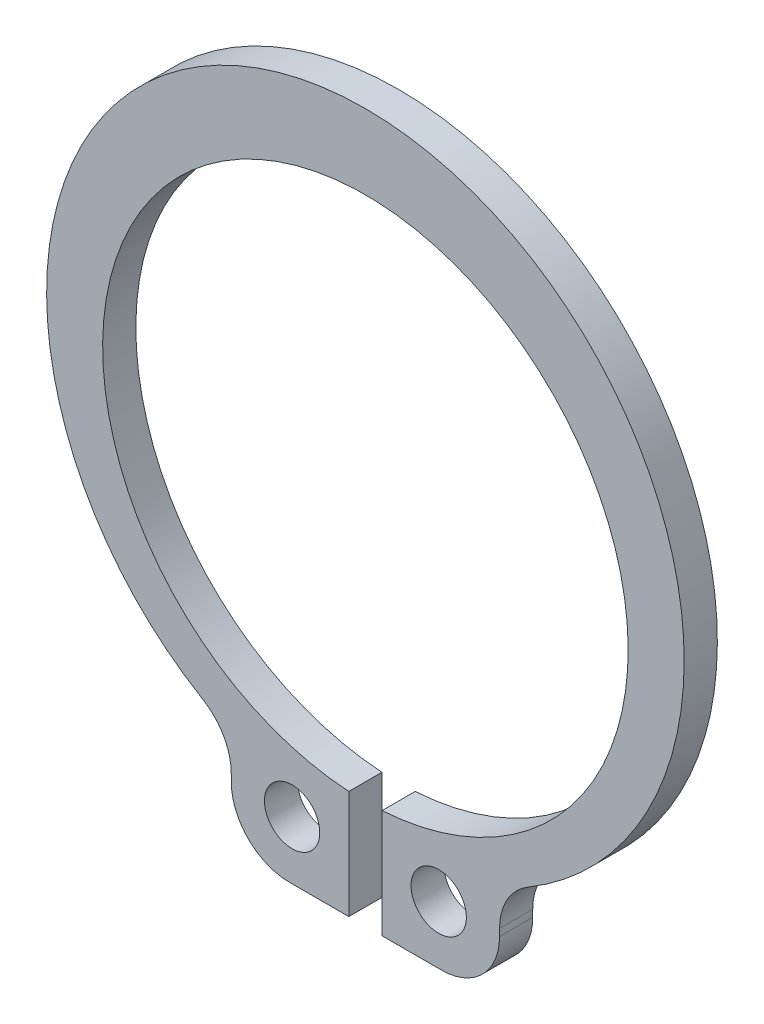
ISO-10303-21;
HEADER;
FILE_DESCRIPTION(('STEP AP214'),'2;1');
FILE_NAME('part.step','',(''),(''),'','','');
FILE_SCHEMA(('AUTOMOTIVE_DESIGN { 1 0 10303 214 1 1 1 1 }'));
ENDSEC;
DATA;
#1=APPLICATION_CONTEXT('core data for automotive mechanical design processes');
#2=APPLICATION_PROTOCOL_DEFINITION('international standard','automotive_design',2000,#1);
#3=PRODUCT_CONTEXT('',#1,'mechanical');
#4=PRODUCT('Part','Part','',(#3));
#5=PRODUCT_RELATED_PRODUCT_CATEGORY('part','',(#4));
#6=PRODUCT_DEFINITION_FORMATION('','',#4);
#7=PRODUCT_DEFINITION_CONTEXT('part definition',#1,'design');
#8=PRODUCT_DEFINITION('design','',#6,#7);
#9=PRODUCT_DEFINITION_SHAPE('','',#8);
#10=(LENGTH_UNIT() NAMED_UNIT(*) SI_UNIT(.MILLI.,.METRE.));
#11=(NAMED_UNIT(*) PLANE_ANGLE_UNIT() SI_UNIT($,.RADIAN.));
#12=(NAMED_UNIT(*) SI_UNIT($,.STERADIAN.) SOLID_ANGLE_UNIT());
#13=UNCERTAINTY_MEASURE_WITH_UNIT(LENGTH_MEASURE(1.E-05),#10,'distance_accuracy_value','');
#14=(GEOMETRIC_REPRESENTATION_CONTEXT(3) GLOBAL_UNCERTAINTY_ASSIGNED_CONTEXT((#13)) GLOBAL_UNIT_ASSIGNED_CONTEXT((#10,
#11,#12)) REPRESENTATION_CONTEXT('',''));
#15=CARTESIAN_POINT('',(0.,0.,0.));
#16=DIRECTION('',(0.,0.,1.));
#17=DIRECTION('',(1.,0.,0.));
#18=AXIS2_PLACEMENT_3D('',#15,#16,#17);
#19=CARTESIAN_POINT('',(0.,0.674999999999998,1.2));
#20=DIRECTION('',(0.,0.,-1.));
#21=DIRECTION('',(-1.,0.,0.));
#22=AXIS2_PLACEMENT_3D('',#19,#20,#21);
#23=CYLINDRICAL_SURFACE('',#22,11.525);
#24=CARTESIAN_POINT('',(0.,0.674999999999998,1.2));
#25=DIRECTION('',(0.,0.,1.));
#26=DIRECTION('',(1.,0.,0.));
#27=AXIS2_PLACEMENT_3D('',#24,#25,#26);
#28=CIRCLE('',#27,11.525);
#29=CARTESIAN_POINT('',(5.87880733944954,-9.23788299465066,1.2));
#30=VERTEX_POINT('',#29);
#31=CARTESIAN_POINT('',(-5.87880733944954,-9.23788299465066,1.2));
#32=VERTEX_POINT('',#31);
#33=EDGE_CURVE('E184',#30,#32,#28,.T.);
#34=ORIENTED_EDGE('',*,*,#33,.F.);
#35=DIRECTION('',(0.,0.,-1.));
#36=VECTOR('',#35,1.);
#37=CARTESIAN_POINT('',(5.87880733944954,-9.23788299465066,1.2));
#38=LINE('',#37,#36);
#39=CARTESIAN_POINT('',(5.87880733944954,-9.23788299465066,0.));
#40=VERTEX_POINT('',#39);
#41=EDGE_CURVE('E192',#30,#40,#38,.T.);
#42=ORIENTED_EDGE('',*,*,#41,.T.);
#43=CARTESIAN_POINT('',(0.,0.674999999999998,0.));
#44=DIRECTION('',(0.,0.,1.));
#45=DIRECTION('',(1.,0.,0.));
#46=AXIS2_PLACEMENT_3D('',#43,#44,#45);
#47=CIRCLE('',#46,11.525);
#48=CARTESIAN_POINT('',(-5.87880733944954,-9.23788299465066,0.));
#49=VERTEX_POINT('',#48);
#50=EDGE_CURVE('E166',#40,#49,#47,.T.);
#51=ORIENTED_EDGE('',*,*,#50,.T.);
#52=DIRECTION('',(0.,0.,-1.));
#53=VECTOR('',#52,1.);
#54=CARTESIAN_POINT('',(-5.87880733944954,-9.23788299465066,1.2));
#55=LINE('',#54,#53);
#56=EDGE_CURVE('E148',#49,#32,#55,.F.);
#57=ORIENTED_EDGE('',*,*,#56,.T.);
#58=EDGE_LOOP('',(#34,#42,#51,#57));
#59=FACE_BOUND('',#58,.T.);
#60=ADVANCED_FACE('F43',(#59),#23,.T.);
#61=CARTESIAN_POINT('',(-4.85,-9.77981348470646,1.2));
#62=DIRECTION('',(1.,0.,0.));
#63=DIRECTION('',(0.,0.,-1.));
#64=AXIS2_PLACEMENT_3D('',#61,#62,#63);
#65=PLANE('',#64);
#66=DIRECTION('',(0.,-1.,0.));
#67=VECTOR('',#66,1.);
#68=CARTESIAN_POINT('',(-4.85,-9.77981348470646,0.));
#69=LINE('',#68,#67);
#70=CARTESIAN_POINT('',(-4.85,-11.0441349936759,0.));
#71=VERTEX_POINT('',#70);
#72=CARTESIAN_POINT('',(-4.85,-11.3,0.));
#73=VERTEX_POINT('',#72);
#74=EDGE_CURVE('E169',#71,#73,#69,.T.);
#75=ORIENTED_EDGE('',*,*,#74,.T.);
#76=DIRECTION('',(0.,0.,-1.));
#77=VECTOR('',#76,1.);
#78=CARTESIAN_POINT('',(-4.85,-11.3,1.2));
#79=LINE('',#78,#77);
#80=CARTESIAN_POINT('',(-4.85,-11.3,1.2));
#81=VERTEX_POINT('',#80);
#82=EDGE_CURVE('E11',#73,#81,#79,.F.);
#83=ORIENTED_EDGE('',*,*,#82,.T.);
#84=DIRECTION('',(0.,-1.,0.));
#85=VECTOR('',#84,1.);
#86=CARTESIAN_POINT('',(-4.85,-9.77981348470646,1.2));
#87=LINE('',#86,#85);
#88=CARTESIAN_POINT('',(-4.85,-11.0441349936759,1.2));
#89=VERTEX_POINT('',#88);
#90=EDGE_CURVE('E139',#89,#81,#87,.T.);
#91=ORIENTED_EDGE('',*,*,#90,.F.);
#92=DIRECTION('',(0.,0.,1.));
#93=VECTOR('',#92,1.);
#94=CARTESIAN_POINT('',(-4.85,-11.0441349936759,0.));
#95=LINE('',#94,#93);
#96=EDGE_CURVE('E198',#89,#71,#95,.F.);
#97=ORIENTED_EDGE('',*,*,#96,.T.);
#98=EDGE_LOOP('',(#75,#83,#91,#97));
#99=FACE_BOUND('',#98,.T.);
#100=ADVANCED_FACE('F295',(#99),#65,.F.);
#101=CARTESIAN_POINT('',(-4.85,-13.4,1.2));
#102=DIRECTION('',(0.,1.,0.));
#103=DIRECTION('',(0.,0.,1.));
#104=AXIS2_PLACEMENT_3D('',#101,#102,#103);
#105=PLANE('',#104);
#106=DIRECTION('',(1.,0.,0.));
#107=VECTOR('',#106,1.);
#108=CARTESIAN_POINT('',(-4.85,-13.4,1.2));
#109=LINE('',#108,#107);
#110=CARTESIAN_POINT('',(-2.75,-13.4,1.2));
#111=VERTEX_POINT('',#110);
#112=CARTESIAN_POINT('',(-0.600000000000001,-13.4,1.2));
#113=VERTEX_POINT('',#112);
#114=EDGE_CURVE('E129',#111,#113,#109,.T.);
#115=ORIENTED_EDGE('',*,*,#114,.F.);
#116=DIRECTION('',(0.,0.,-1.));
#117=VECTOR('',#116,1.);
#118=CARTESIAN_POINT('',(-2.75,-13.4,1.2));
#119=LINE('',#118,#117);
#120=CARTESIAN_POINT('',(-2.75,-13.4,0.));
#121=VERTEX_POINT('',#120);
#122=EDGE_CURVE('E51',#111,#121,#119,.T.);
#123=ORIENTED_EDGE('',*,*,#122,.T.);
#124=DIRECTION('',(1.,0.,0.));
#125=VECTOR('',#124,1.);
#126=CARTESIAN_POINT('',(-4.85,-13.4,0.));
#127=LINE('',#126,#125);
#128=CARTESIAN_POINT('',(-0.600000000000001,-13.4,0.));
#129=VERTEX_POINT('',#128);
#130=EDGE_CURVE('E145',#121,#129,#127,.T.);
#131=ORIENTED_EDGE('',*,*,#130,.T.);
#132=DIRECTION('',(0.,0.,-1.));
#133=VECTOR('',#132,1.);
#134=CARTESIAN_POINT('',(-0.600000000000001,-13.4,1.2));
#135=LINE('',#134,#133);
#136=EDGE_CURVE('E142',#113,#129,#135,.T.);
#137=ORIENTED_EDGE('',*,*,#136,.F.);
#138=EDGE_LOOP('',(#115,#123,#131,#137));
#139=FACE_BOUND('',#138,.T.);
#140=ADVANCED_FACE('F143',(#139),#105,.F.);
#141=CARTESIAN_POINT('',(-0.600000000000001,-13.4,1.2));
#142=DIRECTION('',(-1.,0.,0.));
#143=DIRECTION('',(0.,-1.,0.));
#144=AXIS2_PLACEMENT_3D('',#141,#142,#143);
#145=PLANE('',#144);
#146=DIRECTION('',(0.,1.,0.));
#147=VECTOR('',#146,1.);
#148=CARTESIAN_POINT('',(-0.600000000000001,-13.4,0.));
#149=LINE('',#148,#147);
#150=CARTESIAN_POINT('',(-0.599999999999997,-9.48103369891701,0.));
#151=VERTEX_POINT('',#150);
#152=EDGE_CURVE('E173',#129,#151,#149,.T.);
#153=ORIENTED_EDGE('',*,*,#152,.T.);
#154=DIRECTION('',(0.,0.,-1.));
#155=VECTOR('',#154,1.);
#156=CARTESIAN_POINT('',(-0.599999999999997,-9.48103369891701,1.2));
#157=LINE('',#156,#155);
#158=CARTESIAN_POINT('',(-0.599999999999997,-9.48103369891701,1.2));
#159=VERTEX_POINT('',#158);
#160=EDGE_CURVE('E149',#159,#151,#157,.T.);
#161=ORIENTED_EDGE('',*,*,#160,.F.);
#162=DIRECTION('',(0.,1.,0.));
#163=VECTOR('',#162,1.);
#164=CARTESIAN_POINT('',(-0.600000000000001,-13.4,1.2));
#165=LINE('',#164,#163);
#166=EDGE_CURVE('E134',#113,#159,#165,.T.);
#167=ORIENTED_EDGE('',*,*,#166,.F.);
#168=ORIENTED_EDGE('',*,*,#136,.T.);
#169=EDGE_LOOP('',(#153,#161,#167,#168));
#170=FACE_BOUND('',#169,.T.);
#171=ADVANCED_FACE('F151',(#170),#145,.F.);
#172=CARTESIAN_POINT('',(0.,0.,1.2));
#173=DIRECTION('',(0.,0.,-1.));
#174=DIRECTION('',(-1.,0.,0.));
#175=AXIS2_PLACEMENT_3D('',#172,#173,#174);
#176=CYLINDRICAL_SURFACE('',#175,9.50000000000002);
#177=CARTESIAN_POINT('',(0.,0.,0.));
#178=DIRECTION('',(0.,0.,-1.));
#179=DIRECTION('',(-1.,0.,0.));
#180=AXIS2_PLACEMENT_3D('',#177,#178,#179);
#181=CIRCLE('',#180,9.50000000000002);
#182=CARTESIAN_POINT('',(0.600000000000001,-9.48103369891701,0.));
#183=VERTEX_POINT('',#182);
#184=EDGE_CURVE('E175',#151,#183,#181,.T.);
#185=ORIENTED_EDGE('',*,*,#184,.T.);
#186=DIRECTION('',(0.,0.,-1.));
#187=VECTOR('',#186,1.);
#188=CARTESIAN_POINT('',(0.600000000000001,-9.48103369891701,1.2));
#189=LINE('',#188,#187);
#190=CARTESIAN_POINT('',(0.600000000000001,-9.48103369891701,1.2));
#191=VERTEX_POINT('',#190);
#192=EDGE_CURVE('E187',#191,#183,#189,.T.);
#193=ORIENTED_EDGE('',*,*,#192,.F.);
#194=CARTESIAN_POINT('',(0.,0.,1.2));
#195=DIRECTION('',(0.,0.,-1.));
#196=DIRECTION('',(-1.,0.,0.));
#197=AXIS2_PLACEMENT_3D('',#194,#195,#196);
#198=CIRCLE('',#197,9.50000000000002);
#199=EDGE_CURVE('E154',#159,#191,#198,.T.);
#200=ORIENTED_EDGE('',*,*,#199,.F.);
#201=ORIENTED_EDGE('',*,*,#160,.T.);
#202=EDGE_LOOP('',(#185,#193,#200,#201));
#203=FACE_BOUND('',#202,.T.);
#204=ADVANCED_FACE('F229',(#203),#176,.F.);
#205=CARTESIAN_POINT('',(0.600000000000001,-9.48103369891701,1.2));
#206=DIRECTION('',(1.,0.,0.));
#207=DIRECTION('',(0.,1.,0.));
#208=AXIS2_PLACEMENT_3D('',#205,#206,#207);
#209=PLANE('',#208);
#210=DIRECTION('',(0.,-1.,0.));
#211=VECTOR('',#210,1.);
#212=CARTESIAN_POINT('',(0.600000000000001,-9.48103369891701,0.));
#213=LINE('',#212,#211);
#214=CARTESIAN_POINT('',(0.600000000000001,-13.4,0.));
#215=VERTEX_POINT('',#214);
#216=EDGE_CURVE('E177',#183,#215,#213,.T.);
#217=ORIENTED_EDGE('',*,*,#216,.T.);
#218=DIRECTION('',(0.,0.,-1.));
#219=VECTOR('',#218,1.);
#220=CARTESIAN_POINT('',(0.600000000000001,-13.4,1.2));
#221=LINE('',#220,#219);
#222=CARTESIAN_POINT('',(0.600000000000001,-13.4,1.2));
#223=VERTEX_POINT('',#222);
#224=EDGE_CURVE('E165',#223,#215,#221,.T.);
#225=ORIENTED_EDGE('',*,*,#224,.F.);
#226=DIRECTION('',(0.,-1.,0.));
#227=VECTOR('',#226,1.);
#228=CARTESIAN_POINT('',(0.600000000000001,-9.48103369891701,1.2));
#229=LINE('',#228,#227);
#230=EDGE_CURVE('E156',#191,#223,#229,.T.);
#231=ORIENTED_EDGE('',*,*,#230,.F.);
#232=ORIENTED_EDGE('',*,*,#192,.T.);
#233=EDGE_LOOP('',(#217,#225,#231,#232));
#234=FACE_BOUND('',#233,.T.);
#235=ADVANCED_FACE('F236',(#234),#209,.F.);
#236=CARTESIAN_POINT('',(0.600000000000001,-13.4,1.2));
#237=DIRECTION('',(0.,1.,0.));
#238=DIRECTION('',(-1.,0.,0.));
#239=AXIS2_PLACEMENT_3D('',#236,#237,#238);
#240=PLANE('',#239);
#241=DIRECTION('',(1.,0.,0.));
#242=VECTOR('',#241,1.);
#243=CARTESIAN_POINT('',(0.600000000000001,-13.4,0.));
#244=LINE('',#243,#242);
#245=CARTESIAN_POINT('',(2.75,-13.4,0.));
#246=VERTEX_POINT('',#245);
#247=EDGE_CURVE('E179',#215,#246,#244,.T.);
#248=ORIENTED_EDGE('',*,*,#247,.T.);
#249=DIRECTION('',(0.,0.,-1.));
#250=VECTOR('',#249,1.);
#251=CARTESIAN_POINT('',(2.75,-13.4,1.2));
#252=LINE('',#251,#250);
#253=CARTESIAN_POINT('',(2.75,-13.4,1.2));
#254=VERTEX_POINT('',#253);
#255=EDGE_CURVE('E217',#246,#254,#252,.F.);
#256=ORIENTED_EDGE('',*,*,#255,.T.);
#257=DIRECTION('',(1.,0.,0.));
#258=VECTOR('',#257,1.);
#259=CARTESIAN_POINT('',(0.600000000000001,-13.4,1.2));
#260=LINE('',#259,#258);
#261=EDGE_CURVE('E161',#223,#254,#260,.T.);
#262=ORIENTED_EDGE('',*,*,#261,.F.);
#263=ORIENTED_EDGE('',*,*,#224,.T.);
#264=EDGE_LOOP('',(#248,#256,#262,#263));
#265=FACE_BOUND('',#264,.T.);
#266=ADVANCED_FACE('F239',(#265),#240,.F.);
#267=CARTESIAN_POINT('',(4.85,-13.4,1.2));
#268=DIRECTION('',(-1.,0.,0.));
#269=DIRECTION('',(0.,-1.,0.));
#270=AXIS2_PLACEMENT_3D('',#267,#268,#269);
#271=PLANE('',#270);
#272=DIRECTION('',(0.,1.,0.));
#273=VECTOR('',#272,1.);
#274=CARTESIAN_POINT('',(4.85,-13.4,1.2));
#275=LINE('',#274,#273);
#276=CARTESIAN_POINT('',(4.85,-11.3,1.2));
#277=VERTEX_POINT('',#276);
#278=CARTESIAN_POINT('',(4.85,-11.0441349936759,1.2));
#279=VERTEX_POINT('',#278);
#280=EDGE_CURVE('E163',#277,#279,#275,.T.);
#281=ORIENTED_EDGE('',*,*,#280,.F.);
#282=DIRECTION('',(0.,0.,-1.));
#283=VECTOR('',#282,1.);
#284=CARTESIAN_POINT('',(4.85,-11.3,1.2));
#285=LINE('',#284,#283);
#286=CARTESIAN_POINT('',(4.85,-11.3,0.));
#287=VERTEX_POINT('',#286);
#288=EDGE_CURVE('E210',#277,#287,#285,.T.);
#289=ORIENTED_EDGE('',*,*,#288,.T.);
#290=DIRECTION('',(0.,1.,0.));
#291=VECTOR('',#290,1.);
#292=CARTESIAN_POINT('',(4.85,-13.4,0.));
#293=LINE('',#292,#291);
#294=CARTESIAN_POINT('',(4.85,-11.0441349936759,0.));
#295=VERTEX_POINT('',#294);
#296=EDGE_CURVE('E182',#287,#295,#293,.T.);
#297=ORIENTED_EDGE('',*,*,#296,.T.);
#298=DIRECTION('',(0.,0.,1.));
#299=VECTOR('',#298,1.);
#300=CARTESIAN_POINT('',(4.85,-11.0441349936759,1.2));
#301=LINE('',#300,#299);
#302=EDGE_CURVE('E195',#295,#279,#301,.T.);
#303=ORIENTED_EDGE('',*,*,#302,.T.);
#304=EDGE_LOOP('',(#281,#289,#297,#303));
#305=FACE_BOUND('',#304,.T.);
#306=ADVANCED_FACE('F246',(#305),#271,.F.);
#307=CARTESIAN_POINT('',(0.,0.674999999999998,1.2));
#308=DIRECTION('',(0.,0.,1.));
#309=DIRECTION('',(1.,0.,0.));
#310=AXIS2_PLACEMENT_3D('',#307,#308,#309);
#311=PLANE('',#310);
#312=CARTESIAN_POINT('',(-2.65,-11.3,1.2));
#313=DIRECTION('',(0.,0.,-1.));
#314=DIRECTION('',(-1.,0.,0.));
#315=AXIS2_PLACEMENT_3D('',#312,#313,#314);
#316=CIRCLE('',#315,1.);
#317=CARTESIAN_POINT('',(-3.65,-11.3,1.2));
#318=VERTEX_POINT('',#317);
#319=EDGE_CURVE('E263',#318,#318,#316,.T.);
#320=ORIENTED_EDGE('',*,*,#319,.T.);
#321=EDGE_LOOP('',(#320));
#322=FACE_BOUND('',#321,.T.);
#323=CARTESIAN_POINT('',(2.65,-11.3,1.2));
#324=DIRECTION('',(0.,0.,-1.));
#325=DIRECTION('',(-1.,0.,0.));
#326=AXIS2_PLACEMENT_3D('',#323,#324,#325);
#327=CIRCLE('',#326,1.);
#328=CARTESIAN_POINT('',(1.65,-11.3,1.2));
#329=VERTEX_POINT('',#328);
#330=EDGE_CURVE('E170',#329,#329,#327,.T.);
#331=ORIENTED_EDGE('',*,*,#330,.T.);
#332=EDGE_LOOP('',(#331));
#333=FACE_BOUND('',#332,.T.);
#334=ORIENTED_EDGE('',*,*,#261,.T.);
#335=CARTESIAN_POINT('',(2.75,-11.3,1.2));
#336=DIRECTION('',(0.,0.,1.));
#337=DIRECTION('',(1.,0.,0.));
#338=AXIS2_PLACEMENT_3D('',#335,#336,#337);
#339=CIRCLE('',#338,2.1);
#340=EDGE_CURVE('E220',#254,#277,#339,.T.);
#341=ORIENTED_EDGE('',*,*,#340,.T.);
#342=ORIENTED_EDGE('',*,*,#280,.T.);
#343=CARTESIAN_POINT('',(6.95,-11.0441349936759,1.2));
#344=DIRECTION('',(0.,0.,1.));
#345=DIRECTION('',(1.,0.,0.));
#346=AXIS2_PLACEMENT_3D('',#343,#344,#345);
#347=CIRCLE('',#346,2.1);
#348=EDGE_CURVE('E204',#279,#30,#347,.F.);
#349=ORIENTED_EDGE('',*,*,#348,.T.);
#350=ORIENTED_EDGE('',*,*,#33,.T.);
#351=CARTESIAN_POINT('',(-6.95,-11.0441349936759,1.2));
#352=DIRECTION('',(0.,0.,1.));
#353=DIRECTION('',(1.,0.,0.));
#354=AXIS2_PLACEMENT_3D('',#351,#352,#353);
#355=CIRCLE('',#354,2.1);
#356=EDGE_CURVE('E208',#32,#89,#355,.F.);
#357=ORIENTED_EDGE('',*,*,#356,.T.);
#358=ORIENTED_EDGE('',*,*,#90,.T.);
#359=CARTESIAN_POINT('',(-2.75,-11.3,1.2));
#360=DIRECTION('',(0.,0.,1.));
#361=DIRECTION('',(1.,0.,0.));
#362=AXIS2_PLACEMENT_3D('',#359,#360,#361);
#363=CIRCLE('',#362,2.1);
#364=EDGE_CURVE('E58',#81,#111,#363,.T.);
#365=ORIENTED_EDGE('',*,*,#364,.T.);
#366=ORIENTED_EDGE('',*,*,#114,.T.);
#367=ORIENTED_EDGE('',*,*,#166,.T.);
#368=ORIENTED_EDGE('',*,*,#199,.T.);
#369=ORIENTED_EDGE('',*,*,#230,.T.);
#370=EDGE_LOOP('',(#334,#341,#342,#349,#350,#357,#358,#365,#366,#367,#368,#369));
#371=FACE_BOUND('',#370,.T.);
#372=ADVANCED_FACE('F132',(#322,#333,#371),#311,.T.);
#373=CARTESIAN_POINT('',(0.,0.674999999999998,0.));
#374=DIRECTION('',(0.,0.,1.));
#375=DIRECTION('',(1.,0.,0.));
#376=AXIS2_PLACEMENT_3D('',#373,#374,#375);
#377=PLANE('',#376);
#378=CARTESIAN_POINT('',(-2.65,-11.3,0.));
#379=DIRECTION('',(0.,0.,-1.));
#380=DIRECTION('',(-1.,0.,0.));
#381=AXIS2_PLACEMENT_3D('',#378,#379,#380);
#382=CIRCLE('',#381,1.);
#383=CARTESIAN_POINT('',(-3.65,-11.3,0.));
#384=VERTEX_POINT('',#383);
#385=EDGE_CURVE('E266',#384,#384,#382,.T.);
#386=ORIENTED_EDGE('',*,*,#385,.F.);
#387=EDGE_LOOP('',(#386));
#388=FACE_BOUND('',#387,.T.);
#389=CARTESIAN_POINT('',(2.65,-11.3,0.));
#390=DIRECTION('',(0.,0.,-1.));
#391=DIRECTION('',(-1.,0.,0.));
#392=AXIS2_PLACEMENT_3D('',#389,#390,#391);
#393=CIRCLE('',#392,1.);
#394=CARTESIAN_POINT('',(1.65,-11.3,0.));
#395=VERTEX_POINT('',#394);
#396=EDGE_CURVE('E260',#395,#395,#393,.T.);
#397=ORIENTED_EDGE('',*,*,#396,.F.);
#398=EDGE_LOOP('',(#397));
#399=FACE_BOUND('',#398,.T.);
#400=ORIENTED_EDGE('',*,*,#296,.F.);
#401=CARTESIAN_POINT('',(2.75,-11.3,0.));
#402=DIRECTION('',(0.,0.,1.));
#403=DIRECTION('',(1.,0.,0.));
#404=AXIS2_PLACEMENT_3D('',#401,#402,#403);
#405=CIRCLE('',#404,2.1);
#406=EDGE_CURVE('E215',#287,#246,#405,.F.);
#407=ORIENTED_EDGE('',*,*,#406,.T.);
#408=ORIENTED_EDGE('',*,*,#247,.F.);
#409=ORIENTED_EDGE('',*,*,#216,.F.);
#410=ORIENTED_EDGE('',*,*,#184,.F.);
#411=ORIENTED_EDGE('',*,*,#152,.F.);
#412=ORIENTED_EDGE('',*,*,#130,.F.);
#413=CARTESIAN_POINT('',(-2.75,-11.3,0.));
#414=DIRECTION('',(0.,0.,1.));
#415=DIRECTION('',(1.,0.,0.));
#416=AXIS2_PLACEMENT_3D('',#413,#414,#415);
#417=CIRCLE('',#416,2.1);
#418=EDGE_CURVE('E213',#121,#73,#417,.F.);
#419=ORIENTED_EDGE('',*,*,#418,.T.);
#420=ORIENTED_EDGE('',*,*,#74,.F.);
#421=CARTESIAN_POINT('',(-6.95,-11.0441349936759,0.));
#422=DIRECTION('',(0.,0.,1.));
#423=DIRECTION('',(1.,0.,0.));
#424=AXIS2_PLACEMENT_3D('',#421,#422,#423);
#425=CIRCLE('',#424,2.1);
#426=EDGE_CURVE('E206',#71,#49,#425,.T.);
#427=ORIENTED_EDGE('',*,*,#426,.T.);
#428=ORIENTED_EDGE('',*,*,#50,.F.);
#429=CARTESIAN_POINT('',(6.95,-11.0441349936759,0.));
#430=DIRECTION('',(0.,0.,1.));
#431=DIRECTION('',(1.,0.,0.));
#432=AXIS2_PLACEMENT_3D('',#429,#430,#431);
#433=CIRCLE('',#432,2.1);
#434=EDGE_CURVE('E201',#40,#295,#433,.T.);
#435=ORIENTED_EDGE('',*,*,#434,.T.);
#436=EDGE_LOOP('',(#400,#407,#408,#409,#410,#411,#412,#419,#420,#427,#428,#435));
#437=FACE_BOUND('',#436,.T.);
#438=ADVANCED_FACE('F224',(#388,#399,#437),#377,.F.);
#439=CARTESIAN_POINT('',(2.65,-11.3,1.2));
#440=DIRECTION('',(0.,0.,-1.));
#441=DIRECTION('',(-1.,0.,0.));
#442=AXIS2_PLACEMENT_3D('',#439,#440,#441);
#443=CYLINDRICAL_SURFACE('',#442,1.);
#444=ORIENTED_EDGE('',*,*,#330,.F.);
#445=EDGE_LOOP('',(#444));
#446=FACE_BOUND('',#445,.T.);
#447=ORIENTED_EDGE('',*,*,#396,.T.);
#448=EDGE_LOOP('',(#447));
#449=FACE_BOUND('',#448,.T.);
#450=ADVANCED_FACE('F277',(#446,#449),#443,.F.);
#451=CARTESIAN_POINT('',(-2.65,-11.3,1.2));
#452=DIRECTION('',(0.,0.,-1.));
#453=DIRECTION('',(-1.,0.,0.));
#454=AXIS2_PLACEMENT_3D('',#451,#452,#453);
#455=CYLINDRICAL_SURFACE('',#454,1.);
#456=ORIENTED_EDGE('',*,*,#319,.F.);
#457=EDGE_LOOP('',(#456));
#458=FACE_BOUND('',#457,.T.);
#459=ORIENTED_EDGE('',*,*,#385,.T.);
#460=EDGE_LOOP('',(#459));
#461=FACE_BOUND('',#460,.T.);
#462=ADVANCED_FACE('F274',(#458,#461),#455,.F.);
#463=CARTESIAN_POINT('',(6.95,-11.0441349936759,1.2));
#464=DIRECTION('',(0.,0.,-1.));
#465=DIRECTION('',(-1.,0.,0.));
#466=AXIS2_PLACEMENT_3D('',#463,#464,#465);
#467=CYLINDRICAL_SURFACE('',#466,2.1);
#468=ORIENTED_EDGE('',*,*,#348,.F.);
#469=ORIENTED_EDGE('',*,*,#302,.F.);
#470=ORIENTED_EDGE('',*,*,#434,.F.);
#471=ORIENTED_EDGE('',*,*,#41,.F.);
#472=EDGE_LOOP('',(#468,#469,#470,#471));
#473=FACE_BOUND('',#472,.T.);
#474=ADVANCED_FACE('F251',(#473),#467,.F.);
#475=CARTESIAN_POINT('',(-6.95,-11.0441349936759,1.2));
#476=DIRECTION('',(0.,0.,-1.));
#477=DIRECTION('',(-1.,0.,0.));
#478=AXIS2_PLACEMENT_3D('',#475,#476,#477);
#479=CYLINDRICAL_SURFACE('',#478,2.1);
#480=ORIENTED_EDGE('',*,*,#356,.F.);
#481=ORIENTED_EDGE('',*,*,#56,.F.);
#482=ORIENTED_EDGE('',*,*,#426,.F.);
#483=ORIENTED_EDGE('',*,*,#96,.F.);
#484=EDGE_LOOP('',(#480,#481,#482,#483));
#485=FACE_BOUND('',#484,.T.);
#486=ADVANCED_FACE('F305',(#485),#479,.F.);
#487=CARTESIAN_POINT('',(2.75,-11.3,1.2));
#488=DIRECTION('',(0.,0.,-1.));
#489=DIRECTION('',(-1.,0.,0.));
#490=AXIS2_PLACEMENT_3D('',#487,#488,#489);
#491=CYLINDRICAL_SURFACE('',#490,2.1);
#492=ORIENTED_EDGE('',*,*,#340,.F.);
#493=ORIENTED_EDGE('',*,*,#255,.F.);
#494=ORIENTED_EDGE('',*,*,#406,.F.);
#495=ORIENTED_EDGE('',*,*,#288,.F.);
#496=EDGE_LOOP('',(#492,#493,#494,#495));
#497=FACE_BOUND('',#496,.T.);
#498=ADVANCED_FACE('F242',(#497),#491,.T.);
#499=CARTESIAN_POINT('',(-2.75,-11.3,1.2));
#500=DIRECTION('',(0.,0.,-1.));
#501=DIRECTION('',(-1.,0.,0.));
#502=AXIS2_PLACEMENT_3D('',#499,#500,#501);
#503=CYLINDRICAL_SURFACE('',#502,2.1);
#504=ORIENTED_EDGE('',*,*,#364,.F.);
#505=ORIENTED_EDGE('',*,*,#82,.F.);
#506=ORIENTED_EDGE('',*,*,#418,.F.);
#507=ORIENTED_EDGE('',*,*,#122,.F.);
#508=EDGE_LOOP('',(#504,#505,#506,#507));
#509=FACE_BOUND('',#508,.T.);
#510=ADVANCED_FACE('F45',(#509),#503,.T.);
#511=CLOSED_SHELL('',(#60,#100,#140,#171,#204,#235,#266,#306,#372,#438,#450,#462,#474,#486,#498,#510));
#512=MANIFOLD_SOLID_BREP('B2',#511);
#513=ADVANCED_BREP_SHAPE_REPRESENTATION('',(#18,#512),#14);
#514=SHAPE_DEFINITION_REPRESENTATION(#9,#513);
ENDSEC;
END-ISO-10303-21;
